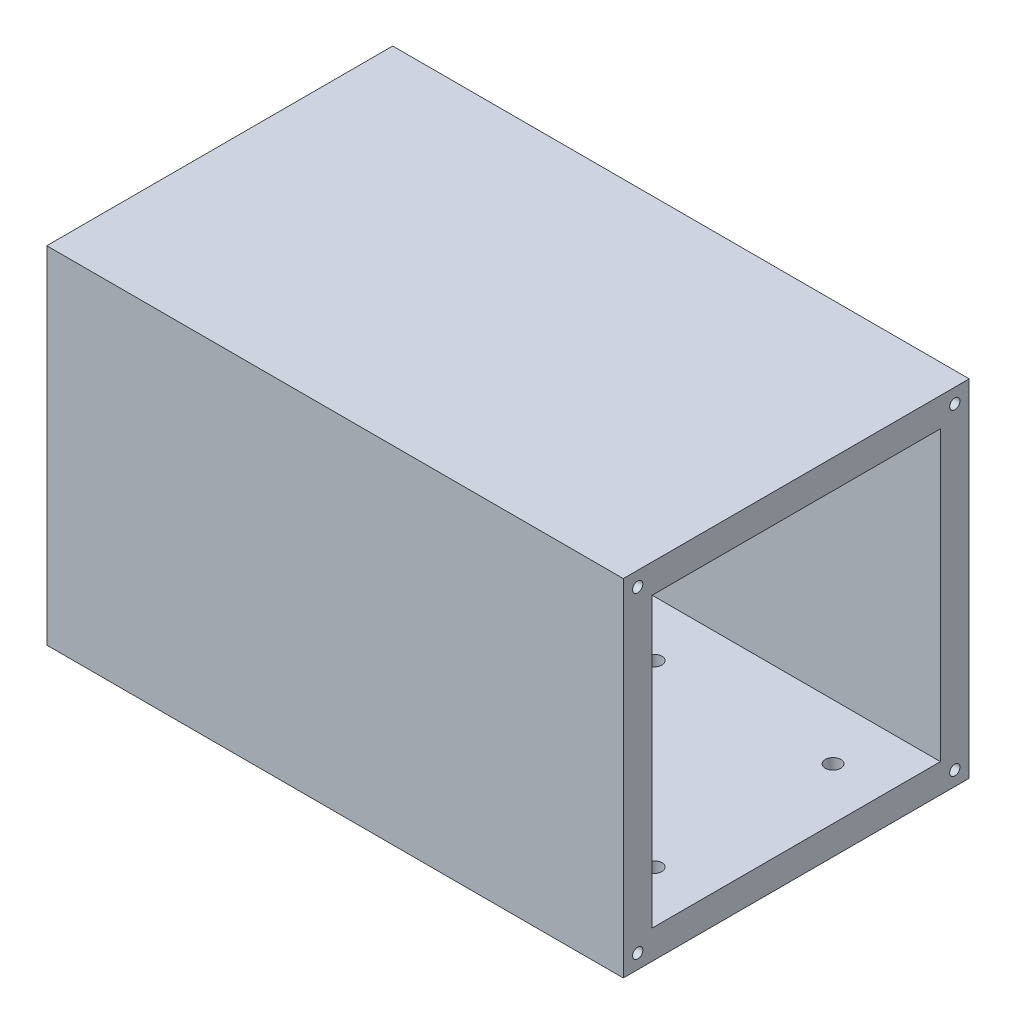
ISO-10303-21;
HEADER;
FILE_DESCRIPTION(('STEP AP214'),'2;1');
FILE_NAME('part.step','',(''),(''),'','','');
FILE_SCHEMA(('AUTOMOTIVE_DESIGN { 1 0 10303 214 1 1 1 1 }'));
ENDSEC;
DATA;
#1=APPLICATION_CONTEXT('core data for automotive mechanical design processes');
#2=APPLICATION_PROTOCOL_DEFINITION('international standard','automotive_design',2000,#1);
#3=PRODUCT_CONTEXT('',#1,'mechanical');
#4=PRODUCT('Part','Part','',(#3));
#5=PRODUCT_RELATED_PRODUCT_CATEGORY('part','',(#4));
#6=PRODUCT_DEFINITION_FORMATION('','',#4);
#7=PRODUCT_DEFINITION_CONTEXT('part definition',#1,'design');
#8=PRODUCT_DEFINITION('design','',#6,#7);
#9=PRODUCT_DEFINITION_SHAPE('','',#8);
#10=(LENGTH_UNIT() NAMED_UNIT(*) SI_UNIT(.MILLI.,.METRE.));
#11=(NAMED_UNIT(*) PLANE_ANGLE_UNIT() SI_UNIT($,.RADIAN.));
#12=(NAMED_UNIT(*) SI_UNIT($,.STERADIAN.) SOLID_ANGLE_UNIT());
#13=UNCERTAINTY_MEASURE_WITH_UNIT(LENGTH_MEASURE(1.E-05),#10,'distance_accuracy_value','');
#14=(GEOMETRIC_REPRESENTATION_CONTEXT(3) GLOBAL_UNCERTAINTY_ASSIGNED_CONTEXT((#13)) GLOBAL_UNIT_ASSIGNED_CONTEXT((#10,
#11,#12)) REPRESENTATION_CONTEXT('',''));
#15=CARTESIAN_POINT('',(0.,0.,0.));
#16=DIRECTION('',(0.,0.,1.));
#17=DIRECTION('',(1.,0.,0.));
#18=AXIS2_PLACEMENT_3D('',#15,#16,#17);
#19=CARTESIAN_POINT('',(-63.5,38.1,-38.1));
#20=DIRECTION('',(0.,0.,-1.));
#21=DIRECTION('',(0.,1.,0.));
#22=AXIS2_PLACEMENT_3D('',#19,#20,#21);
#23=PLANE('',#22);
#24=DIRECTION('',(1.,0.,0.));
#25=VECTOR('',#24,1.);
#26=CARTESIAN_POINT('',(-63.5,38.1,-38.1));
#27=LINE('',#26,#25);
#28=CARTESIAN_POINT('',(-63.5,38.1,-38.1));
#29=VERTEX_POINT('',#28);
#30=CARTESIAN_POINT('',(63.5,38.1,-38.1));
#31=VERTEX_POINT('',#30);
#32=EDGE_CURVE('E52',#29,#31,#27,.T.);
#33=ORIENTED_EDGE('',*,*,#32,.T.);
#34=DIRECTION('',(0.,1.,0.));
#35=VECTOR('',#34,1.);
#36=CARTESIAN_POINT('',(63.5,38.1,-38.1));
#37=LINE('',#36,#35);
#38=CARTESIAN_POINT('',(63.5,-38.1,-38.1));
#39=VERTEX_POINT('',#38);
#40=EDGE_CURVE('E207',#39,#31,#37,.T.);
#41=ORIENTED_EDGE('',*,*,#40,.F.);
#42=DIRECTION('',(1.,0.,0.));
#43=VECTOR('',#42,1.);
#44=CARTESIAN_POINT('',(-63.5,-38.1,-38.1));
#45=LINE('',#44,#43);
#46=CARTESIAN_POINT('',(-63.5,-38.1,-38.1));
#47=VERTEX_POINT('',#46);
#48=EDGE_CURVE('E13',#47,#39,#45,.T.);
#49=ORIENTED_EDGE('',*,*,#48,.F.);
#50=DIRECTION('',(0.,1.,0.));
#51=VECTOR('',#50,1.);
#52=CARTESIAN_POINT('',(-63.5,38.1,-38.1));
#53=LINE('',#52,#51);
#54=EDGE_CURVE('E232',#47,#29,#53,.T.);
#55=ORIENTED_EDGE('',*,*,#54,.T.);
#56=EDGE_LOOP('',(#33,#41,#49,#55));
#57=FACE_BOUND('',#56,.T.);
#58=ADVANCED_FACE('F49',(#57),#23,.T.);
#59=CARTESIAN_POINT('',(-63.5,-38.1,38.1));
#60=DIRECTION('',(0.,-1.,0.));
#61=DIRECTION('',(0.,0.,-1.));
#62=AXIS2_PLACEMENT_3D('',#59,#60,#61);
#63=PLANE('',#62);
#64=CARTESIAN_POINT('',(52.09999994,-38.1,-19.499999922));
#65=DIRECTION('',(0.,-1.,0.));
#66=DIRECTION('',(0.,0.,-1.));
#67=AXIS2_PLACEMENT_3D('',#64,#65,#66);
#68=CIRCLE('',#67,3.25);
#69=CARTESIAN_POINT('',(52.09999994,-38.1,-22.749999922));
#70=VERTEX_POINT('',#69);
#71=EDGE_CURVE('E713',#70,#70,#68,.T.);
#72=ORIENTED_EDGE('',*,*,#71,.F.);
#73=EDGE_LOOP('',(#72));
#74=FACE_BOUND('',#73,.T.);
#75=CARTESIAN_POINT('',(12.7,-38.1,-19.499999922));
#76=DIRECTION('',(0.,-1.,0.));
#77=DIRECTION('',(0.,0.,-1.));
#78=AXIS2_PLACEMENT_3D('',#75,#76,#77);
#79=CIRCLE('',#78,3.25);
#80=CARTESIAN_POINT('',(12.7,-38.1,-22.749999922));
#81=VERTEX_POINT('',#80);
#82=EDGE_CURVE('E723',#81,#81,#79,.T.);
#83=ORIENTED_EDGE('',*,*,#82,.F.);
#84=EDGE_LOOP('',(#83));
#85=FACE_BOUND('',#84,.T.);
#86=CARTESIAN_POINT('',(12.7,-38.1,19.900000078));
#87=DIRECTION('',(0.,-1.,0.));
#88=DIRECTION('',(0.,0.,-1.));
#89=AXIS2_PLACEMENT_3D('',#86,#87,#88);
#90=CIRCLE('',#89,3.25);
#91=CARTESIAN_POINT('',(12.7,-38.1,16.650000078));
#92=VERTEX_POINT('',#91);
#93=EDGE_CURVE('E735',#92,#92,#90,.T.);
#94=ORIENTED_EDGE('',*,*,#93,.F.);
#95=EDGE_LOOP('',(#94));
#96=FACE_BOUND('',#95,.T.);
#97=CARTESIAN_POINT('',(52.1,-38.1,19.900000078));
#98=DIRECTION('',(0.,-1.,0.));
#99=DIRECTION('',(0.,0.,-1.));
#100=AXIS2_PLACEMENT_3D('',#97,#98,#99);
#101=CIRCLE('',#100,3.25);
#102=CARTESIAN_POINT('',(52.1,-38.1,16.650000078));
#103=VERTEX_POINT('',#102);
#104=EDGE_CURVE('E747',#103,#103,#101,.T.);
#105=ORIENTED_EDGE('',*,*,#104,.F.);
#106=EDGE_LOOP('',(#105));
#107=FACE_BOUND('',#106,.T.);
#108=ORIENTED_EDGE('',*,*,#48,.T.);
#109=DIRECTION('',(0.,0.,-1.));
#110=VECTOR('',#109,1.);
#111=CARTESIAN_POINT('',(63.5,-38.1,38.1));
#112=LINE('',#111,#110);
#113=CARTESIAN_POINT('',(63.5,-38.1,38.1));
#114=VERTEX_POINT('',#113);
#115=EDGE_CURVE('E216',#114,#39,#112,.T.);
#116=ORIENTED_EDGE('',*,*,#115,.F.);
#117=DIRECTION('',(1.,0.,0.));
#118=VECTOR('',#117,1.);
#119=CARTESIAN_POINT('',(-63.5,-38.1,38.1));
#120=LINE('',#119,#118);
#121=CARTESIAN_POINT('',(-63.5,-38.1,38.1));
#122=VERTEX_POINT('',#121);
#123=EDGE_CURVE('E57',#122,#114,#120,.T.);
#124=ORIENTED_EDGE('',*,*,#123,.F.);
#125=DIRECTION('',(0.,0.,-1.));
#126=VECTOR('',#125,1.);
#127=CARTESIAN_POINT('',(-63.5,-38.1,38.1));
#128=LINE('',#127,#126);
#129=EDGE_CURVE('E245',#122,#47,#128,.T.);
#130=ORIENTED_EDGE('',*,*,#129,.T.);
#131=EDGE_LOOP('',(#108,#116,#124,#130));
#132=FACE_BOUND('',#131,.T.);
#133=ADVANCED_FACE('F259',(#74,#85,#96,#107,#132),#63,.T.);
#134=CARTESIAN_POINT('',(-63.5,38.1,38.1));
#135=DIRECTION('',(0.,0.,1.));
#136=DIRECTION('',(0.,-1.,0.));
#137=AXIS2_PLACEMENT_3D('',#134,#135,#136);
#138=PLANE('',#137);
#139=ORIENTED_EDGE('',*,*,#123,.T.);
#140=DIRECTION('',(0.,-1.,0.));
#141=VECTOR('',#140,1.);
#142=CARTESIAN_POINT('',(63.5,38.1,38.1));
#143=LINE('',#142,#141);
#144=CARTESIAN_POINT('',(63.5,38.1,38.1));
#145=VERTEX_POINT('',#144);
#146=EDGE_CURVE('E213',#145,#114,#143,.T.);
#147=ORIENTED_EDGE('',*,*,#146,.F.);
#148=DIRECTION('',(1.,0.,0.));
#149=VECTOR('',#148,1.);
#150=CARTESIAN_POINT('',(-63.5,38.1,38.1));
#151=LINE('',#150,#149);
#152=CARTESIAN_POINT('',(-63.5,38.1,38.1));
#153=VERTEX_POINT('',#152);
#154=EDGE_CURVE('E248',#153,#145,#151,.T.);
#155=ORIENTED_EDGE('',*,*,#154,.F.);
#156=DIRECTION('',(0.,-1.,0.));
#157=VECTOR('',#156,1.);
#158=CARTESIAN_POINT('',(-63.5,38.1,38.1));
#159=LINE('',#158,#157);
#160=EDGE_CURVE('E242',#153,#122,#159,.T.);
#161=ORIENTED_EDGE('',*,*,#160,.T.);
#162=EDGE_LOOP('',(#139,#147,#155,#161));
#163=FACE_BOUND('',#162,.T.);
#164=ADVANCED_FACE('F265',(#163),#138,.T.);
#165=CARTESIAN_POINT('',(-63.5,38.1,38.1));
#166=DIRECTION('',(0.,1.,0.));
#167=DIRECTION('',(0.,0.,1.));
#168=AXIS2_PLACEMENT_3D('',#165,#166,#167);
#169=PLANE('',#168);
#170=ORIENTED_EDGE('',*,*,#154,.T.);
#171=DIRECTION('',(0.,0.,1.));
#172=VECTOR('',#171,1.);
#173=CARTESIAN_POINT('',(63.5,38.1,38.1));
#174=LINE('',#173,#172);
#175=EDGE_CURVE('E210',#31,#145,#174,.T.);
#176=ORIENTED_EDGE('',*,*,#175,.F.);
#177=ORIENTED_EDGE('',*,*,#32,.F.);
#178=DIRECTION('',(0.,0.,1.));
#179=VECTOR('',#178,1.);
#180=CARTESIAN_POINT('',(-63.5,38.1,38.1));
#181=LINE('',#180,#179);
#182=EDGE_CURVE('E239',#29,#153,#181,.T.);
#183=ORIENTED_EDGE('',*,*,#182,.T.);
#184=EDGE_LOOP('',(#170,#176,#177,#183));
#185=FACE_BOUND('',#184,.T.);
#186=ADVANCED_FACE('F252',(#185),#169,.T.);
#187=CARTESIAN_POINT('',(-63.5,0.,0.));
#188=DIRECTION('',(1.,0.,0.));
#189=DIRECTION('',(0.,0.,-1.));
#190=AXIS2_PLACEMENT_3D('',#187,#188,#189);
#191=PLANE('',#190);
#192=CARTESIAN_POINT('',(-63.5,34.925,34.925));
#193=DIRECTION('',(-1.,0.,0.));
#194=DIRECTION('',(0.,0.,1.));
#195=AXIS2_PLACEMENT_3D('',#192,#193,#194);
#196=CIRCLE('',#195,1.1303);
#197=CARTESIAN_POINT('',(-63.5,34.925,36.0553));
#198=VERTEX_POINT('',#197);
#199=EDGE_CURVE('E147',#198,#198,#196,.T.);
#200=ORIENTED_EDGE('',*,*,#199,.F.);
#201=EDGE_LOOP('',(#200));
#202=FACE_BOUND('',#201,.T.);
#203=CARTESIAN_POINT('',(-63.5,34.925,-34.925));
#204=DIRECTION('',(-1.,0.,0.));
#205=DIRECTION('',(0.,0.,1.));
#206=AXIS2_PLACEMENT_3D('',#203,#204,#205);
#207=CIRCLE('',#206,1.1303);
#208=CARTESIAN_POINT('',(-63.5,34.925,-33.7947));
#209=VERTEX_POINT('',#208);
#210=EDGE_CURVE('E146',#209,#209,#207,.T.);
#211=ORIENTED_EDGE('',*,*,#210,.F.);
#212=EDGE_LOOP('',(#211));
#213=FACE_BOUND('',#212,.T.);
#214=CARTESIAN_POINT('',(-63.5,-34.925,-34.925));
#215=DIRECTION('',(-1.,0.,0.));
#216=DIRECTION('',(0.,0.,1.));
#217=AXIS2_PLACEMENT_3D('',#214,#215,#216);
#218=CIRCLE('',#217,1.1303);
#219=CARTESIAN_POINT('',(-63.5,-34.925,-33.7947));
#220=VERTEX_POINT('',#219);
#221=EDGE_CURVE('E159',#220,#220,#218,.T.);
#222=ORIENTED_EDGE('',*,*,#221,.F.);
#223=EDGE_LOOP('',(#222));
#224=FACE_BOUND('',#223,.T.);
#225=CARTESIAN_POINT('',(-63.5,-34.925,34.925));
#226=DIRECTION('',(-1.,0.,0.));
#227=DIRECTION('',(0.,0.,1.));
#228=AXIS2_PLACEMENT_3D('',#225,#226,#227);
#229=CIRCLE('',#228,1.1303);
#230=CARTESIAN_POINT('',(-63.5,-34.925,36.0553));
#231=VERTEX_POINT('',#230);
#232=EDGE_CURVE('E165',#231,#231,#229,.T.);
#233=ORIENTED_EDGE('',*,*,#232,.F.);
#234=EDGE_LOOP('',(#233));
#235=FACE_BOUND('',#234,.T.);
#236=DIRECTION('',(0.,0.,-1.));
#237=VECTOR('',#236,1.);
#238=CARTESIAN_POINT('',(-63.5,-31.75,31.75));
#239=LINE('',#238,#237);
#240=CARTESIAN_POINT('',(-63.5,-31.75,31.75));
#241=VERTEX_POINT('',#240);
#242=CARTESIAN_POINT('',(-63.5,-31.75,-31.75));
#243=VERTEX_POINT('',#242);
#244=EDGE_CURVE('E226',#241,#243,#239,.T.);
#245=ORIENTED_EDGE('',*,*,#244,.T.);
#246=DIRECTION('',(0.,1.,0.));
#247=VECTOR('',#246,1.);
#248=CARTESIAN_POINT('',(-63.5,-31.75,-31.75));
#249=LINE('',#248,#247);
#250=CARTESIAN_POINT('',(-63.5,31.75,-31.75));
#251=VERTEX_POINT('',#250);
#252=EDGE_CURVE('E219',#243,#251,#249,.T.);
#253=ORIENTED_EDGE('',*,*,#252,.T.);
#254=DIRECTION('',(0.,0.,1.));
#255=VECTOR('',#254,1.);
#256=CARTESIAN_POINT('',(-63.5,31.75,31.75));
#257=LINE('',#256,#255);
#258=CARTESIAN_POINT('',(-63.5,31.75,31.75));
#259=VERTEX_POINT('',#258);
#260=EDGE_CURVE('E222',#251,#259,#257,.T.);
#261=ORIENTED_EDGE('',*,*,#260,.T.);
#262=DIRECTION('',(0.,-1.,0.));
#263=VECTOR('',#262,1.);
#264=CARTESIAN_POINT('',(-63.5,-31.75,31.75));
#265=LINE('',#264,#263);
#266=EDGE_CURVE('E65',#259,#241,#265,.T.);
#267=ORIENTED_EDGE('',*,*,#266,.T.);
#268=EDGE_LOOP('',(#245,#253,#261,#267));
#269=FACE_BOUND('',#268,.T.);
#270=ORIENTED_EDGE('',*,*,#54,.F.);
#271=ORIENTED_EDGE('',*,*,#129,.F.);
#272=ORIENTED_EDGE('',*,*,#160,.F.);
#273=ORIENTED_EDGE('',*,*,#182,.F.);
#274=EDGE_LOOP('',(#270,#271,#272,#273));
#275=FACE_BOUND('',#274,.T.);
#276=ADVANCED_FACE('F263',(#202,#213,#224,#235,#269,#275),#191,.F.);
#277=CARTESIAN_POINT('',(-63.5,-31.75,-31.75));
#278=DIRECTION('',(0.,0.,-1.));
#279=DIRECTION('',(-1.,0.,0.));
#280=AXIS2_PLACEMENT_3D('',#277,#278,#279);
#281=PLANE('',#280);
#282=DIRECTION('',(1.,0.,0.));
#283=VECTOR('',#282,1.);
#284=CARTESIAN_POINT('',(-63.5,-31.75,-31.75));
#285=LINE('',#284,#283);
#286=CARTESIAN_POINT('',(63.5,-31.75,-31.75));
#287=VERTEX_POINT('',#286);
#288=EDGE_CURVE('E230',#243,#287,#285,.T.);
#289=ORIENTED_EDGE('',*,*,#288,.T.);
#290=DIRECTION('',(0.,1.,0.));
#291=VECTOR('',#290,1.);
#292=CARTESIAN_POINT('',(63.5,-31.75,-31.75));
#293=LINE('',#292,#291);
#294=CARTESIAN_POINT('',(63.5,31.75,-31.75));
#295=VERTEX_POINT('',#294);
#296=EDGE_CURVE('E195',#287,#295,#293,.T.);
#297=ORIENTED_EDGE('',*,*,#296,.T.);
#298=DIRECTION('',(1.,0.,0.));
#299=VECTOR('',#298,1.);
#300=CARTESIAN_POINT('',(-63.5,31.75,-31.75));
#301=LINE('',#300,#299);
#302=EDGE_CURVE('E229',#251,#295,#301,.T.);
#303=ORIENTED_EDGE('',*,*,#302,.F.);
#304=ORIENTED_EDGE('',*,*,#252,.F.);
#305=EDGE_LOOP('',(#289,#297,#303,#304));
#306=FACE_BOUND('',#305,.T.);
#307=ADVANCED_FACE('F298',(#306),#281,.F.);
#308=CARTESIAN_POINT('',(-63.5,-31.75,31.75));
#309=DIRECTION('',(0.,-1.,0.));
#310=DIRECTION('',(0.,0.,-1.));
#311=AXIS2_PLACEMENT_3D('',#308,#309,#310);
#312=PLANE('',#311);
#313=CARTESIAN_POINT('',(52.09999994,-31.75,-19.499999922));
#314=DIRECTION('',(0.,-1.,0.));
#315=DIRECTION('',(0.,0.,-1.));
#316=AXIS2_PLACEMENT_3D('',#313,#314,#315);
#317=CIRCLE('',#316,1.7);
#318=CARTESIAN_POINT('',(52.09999994,-31.75,-21.199999922));
#319=VERTEX_POINT('',#318);
#320=EDGE_CURVE('E720',#319,#319,#317,.T.);
#321=ORIENTED_EDGE('',*,*,#320,.T.);
#322=EDGE_LOOP('',(#321));
#323=FACE_BOUND('',#322,.T.);
#324=CARTESIAN_POINT('',(12.7,-31.75,-19.499999922));
#325=DIRECTION('',(0.,-1.,0.));
#326=DIRECTION('',(0.,0.,-1.));
#327=AXIS2_PLACEMENT_3D('',#324,#325,#326);
#328=CIRCLE('',#327,1.7);
#329=CARTESIAN_POINT('',(12.7,-31.75,-21.199999922));
#330=VERTEX_POINT('',#329);
#331=EDGE_CURVE('E732',#330,#330,#328,.T.);
#332=ORIENTED_EDGE('',*,*,#331,.T.);
#333=EDGE_LOOP('',(#332));
#334=FACE_BOUND('',#333,.T.);
#335=CARTESIAN_POINT('',(12.7,-31.75,19.900000078));
#336=DIRECTION('',(0.,-1.,0.));
#337=DIRECTION('',(0.,0.,-1.));
#338=AXIS2_PLACEMENT_3D('',#335,#336,#337);
#339=CIRCLE('',#338,1.7);
#340=CARTESIAN_POINT('',(12.7,-31.75,18.200000078));
#341=VERTEX_POINT('',#340);
#342=EDGE_CURVE('E744',#341,#341,#339,.T.);
#343=ORIENTED_EDGE('',*,*,#342,.T.);
#344=EDGE_LOOP('',(#343));
#345=FACE_BOUND('',#344,.T.);
#346=CARTESIAN_POINT('',(52.1,-31.75,19.900000078));
#347=DIRECTION('',(0.,-1.,0.));
#348=DIRECTION('',(0.,0.,-1.));
#349=AXIS2_PLACEMENT_3D('',#346,#347,#348);
#350=CIRCLE('',#349,1.7);
#351=CARTESIAN_POINT('',(52.1,-31.75,18.200000078));
#352=VERTEX_POINT('',#351);
#353=EDGE_CURVE('E153',#352,#352,#350,.T.);
#354=ORIENTED_EDGE('',*,*,#353,.T.);
#355=EDGE_LOOP('',(#354));
#356=FACE_BOUND('',#355,.T.);
#357=DIRECTION('',(1.,0.,0.));
#358=VECTOR('',#357,1.);
#359=CARTESIAN_POINT('',(-63.5,-31.75,31.75));
#360=LINE('',#359,#358);
#361=CARTESIAN_POINT('',(63.5,-31.75,31.75));
#362=VERTEX_POINT('',#361);
#363=EDGE_CURVE('E233',#241,#362,#360,.T.);
#364=ORIENTED_EDGE('',*,*,#363,.T.);
#365=DIRECTION('',(0.,0.,-1.));
#366=VECTOR('',#365,1.);
#367=CARTESIAN_POINT('',(63.5,-31.75,31.75));
#368=LINE('',#367,#366);
#369=EDGE_CURVE('E204',#362,#287,#368,.T.);
#370=ORIENTED_EDGE('',*,*,#369,.T.);
#371=ORIENTED_EDGE('',*,*,#288,.F.);
#372=ORIENTED_EDGE('',*,*,#244,.F.);
#373=EDGE_LOOP('',(#364,#370,#371,#372));
#374=FACE_BOUND('',#373,.T.);
#375=ADVANCED_FACE('F292',(#323,#334,#345,#356,#374),#312,.F.);
#376=CARTESIAN_POINT('',(-63.5,-31.75,31.75));
#377=DIRECTION('',(0.,0.,1.));
#378=DIRECTION('',(1.,0.,0.));
#379=AXIS2_PLACEMENT_3D('',#376,#377,#378);
#380=PLANE('',#379);
#381=DIRECTION('',(1.,0.,0.));
#382=VECTOR('',#381,1.);
#383=CARTESIAN_POINT('',(-63.5,31.75,31.75));
#384=LINE('',#383,#382);
#385=CARTESIAN_POINT('',(63.5,31.75,31.75));
#386=VERTEX_POINT('',#385);
#387=EDGE_CURVE('E235',#259,#386,#384,.T.);
#388=ORIENTED_EDGE('',*,*,#387,.T.);
#389=DIRECTION('',(0.,-1.,0.));
#390=VECTOR('',#389,1.);
#391=CARTESIAN_POINT('',(63.5,-31.75,31.75));
#392=LINE('',#391,#390);
#393=EDGE_CURVE('E201',#386,#362,#392,.T.);
#394=ORIENTED_EDGE('',*,*,#393,.T.);
#395=ORIENTED_EDGE('',*,*,#363,.F.);
#396=ORIENTED_EDGE('',*,*,#266,.F.);
#397=EDGE_LOOP('',(#388,#394,#395,#396));
#398=FACE_BOUND('',#397,.T.);
#399=ADVANCED_FACE('F297',(#398),#380,.F.);
#400=CARTESIAN_POINT('',(-63.5,31.75,31.75));
#401=DIRECTION('',(0.,1.,0.));
#402=DIRECTION('',(0.,0.,1.));
#403=AXIS2_PLACEMENT_3D('',#400,#401,#402);
#404=PLANE('',#403);
#405=ORIENTED_EDGE('',*,*,#302,.T.);
#406=DIRECTION('',(0.,0.,1.));
#407=VECTOR('',#406,1.);
#408=CARTESIAN_POINT('',(63.5,31.75,31.75));
#409=LINE('',#408,#407);
#410=EDGE_CURVE('E198',#295,#386,#409,.T.);
#411=ORIENTED_EDGE('',*,*,#410,.T.);
#412=ORIENTED_EDGE('',*,*,#387,.F.);
#413=ORIENTED_EDGE('',*,*,#260,.F.);
#414=EDGE_LOOP('',(#405,#411,#412,#413));
#415=FACE_BOUND('',#414,.T.);
#416=ADVANCED_FACE('F593',(#415),#404,.F.);
#417=CARTESIAN_POINT('',(63.5,0.,0.));
#418=DIRECTION('',(1.,0.,0.));
#419=DIRECTION('',(0.,0.,-1.));
#420=AXIS2_PLACEMENT_3D('',#417,#418,#419);
#421=PLANE('',#420);
#422=CARTESIAN_POINT('',(63.5,34.925,34.925));
#423=DIRECTION('',(1.,0.,0.));
#424=DIRECTION('',(0.,0.,-1.));
#425=AXIS2_PLACEMENT_3D('',#422,#423,#424);
#426=CIRCLE('',#425,1.1303);
#427=CARTESIAN_POINT('',(63.5,34.925,33.7947));
#428=VERTEX_POINT('',#427);
#429=EDGE_CURVE('E171',#428,#428,#426,.T.);
#430=ORIENTED_EDGE('',*,*,#429,.F.);
#431=EDGE_LOOP('',(#430));
#432=FACE_BOUND('',#431,.T.);
#433=CARTESIAN_POINT('',(63.5,34.925,-34.925));
#434=DIRECTION('',(1.,0.,0.));
#435=DIRECTION('',(0.,0.,-1.));
#436=AXIS2_PLACEMENT_3D('',#433,#434,#435);
#437=CIRCLE('',#436,1.1303);
#438=CARTESIAN_POINT('',(63.5,34.925,-36.0553));
#439=VERTEX_POINT('',#438);
#440=EDGE_CURVE('E177',#439,#439,#437,.T.);
#441=ORIENTED_EDGE('',*,*,#440,.F.);
#442=EDGE_LOOP('',(#441));
#443=FACE_BOUND('',#442,.T.);
#444=CARTESIAN_POINT('',(63.5,-34.925,-34.925));
#445=DIRECTION('',(1.,0.,0.));
#446=DIRECTION('',(0.,0.,-1.));
#447=AXIS2_PLACEMENT_3D('',#444,#445,#446);
#448=CIRCLE('',#447,1.1303);
#449=CARTESIAN_POINT('',(63.5,-34.925,-36.0553));
#450=VERTEX_POINT('',#449);
#451=EDGE_CURVE('E183',#450,#450,#448,.T.);
#452=ORIENTED_EDGE('',*,*,#451,.F.);
#453=EDGE_LOOP('',(#452));
#454=FACE_BOUND('',#453,.T.);
#455=CARTESIAN_POINT('',(63.5,-34.925,34.925));
#456=DIRECTION('',(1.,0.,0.));
#457=DIRECTION('',(0.,0.,-1.));
#458=AXIS2_PLACEMENT_3D('',#455,#456,#457);
#459=CIRCLE('',#458,1.1303);
#460=CARTESIAN_POINT('',(63.5,-34.925,33.7947));
#461=VERTEX_POINT('',#460);
#462=EDGE_CURVE('E189',#461,#461,#459,.T.);
#463=ORIENTED_EDGE('',*,*,#462,.F.);
#464=EDGE_LOOP('',(#463));
#465=FACE_BOUND('',#464,.T.);
#466=ORIENTED_EDGE('',*,*,#40,.T.);
#467=ORIENTED_EDGE('',*,*,#175,.T.);
#468=ORIENTED_EDGE('',*,*,#146,.T.);
#469=ORIENTED_EDGE('',*,*,#115,.T.);
#470=EDGE_LOOP('',(#466,#467,#468,#469));
#471=FACE_BOUND('',#470,.T.);
#472=ORIENTED_EDGE('',*,*,#410,.F.);
#473=ORIENTED_EDGE('',*,*,#296,.F.);
#474=ORIENTED_EDGE('',*,*,#369,.F.);
#475=ORIENTED_EDGE('',*,*,#393,.F.);
#476=EDGE_LOOP('',(#472,#473,#474,#475));
#477=FACE_BOUND('',#476,.T.);
#478=ADVANCED_FACE('F255',(#432,#443,#454,#465,#471,#477),#421,.T.);
#479=CARTESIAN_POINT('',(55.88,-34.925,34.925));
#480=DIRECTION('',(1.,0.,0.));
#481=DIRECTION('',(0.,0.,-1.));
#482=AXIS2_PLACEMENT_3D('',#479,#480,#481);
#483=CONICAL_SURFACE('',#482,1.13029999999999,1.02974425867666);
#484=CARTESIAN_POINT('',(55.2008472423132,-34.925,34.925));
#485=VERTEX_POINT('',#484);
#486=VERTEX_LOOP('',#485);
#487=FACE_BOUND('',#486,.T.);
#488=CARTESIAN_POINT('',(55.88,-34.925,34.925));
#489=DIRECTION('',(1.,0.,0.));
#490=DIRECTION('',(0.,0.,-1.));
#491=AXIS2_PLACEMENT_3D('',#488,#489,#490);
#492=CIRCLE('',#491,1.13029999999999);
#493=CARTESIAN_POINT('',(55.88,-34.925,33.7947));
#494=VERTEX_POINT('',#493);
#495=EDGE_CURVE('E192',#494,#494,#492,.T.);
#496=ORIENTED_EDGE('',*,*,#495,.T.);
#497=EDGE_LOOP('',(#496));
#498=FACE_BOUND('',#497,.T.);
#499=ADVANCED_FACE('F442',(#487,#498),#483,.F.);
#500=CARTESIAN_POINT('',(63.5,-34.925,34.925));
#501=DIRECTION('',(1.,0.,0.));
#502=DIRECTION('',(0.,0.,-1.));
#503=AXIS2_PLACEMENT_3D('',#500,#501,#502);
#504=CYLINDRICAL_SURFACE('',#503,1.1303);
#505=ORIENTED_EDGE('',*,*,#495,.F.);
#506=EDGE_LOOP('',(#505));
#507=FACE_BOUND('',#506,.T.);
#508=ORIENTED_EDGE('',*,*,#462,.T.);
#509=EDGE_LOOP('',(#508));
#510=FACE_BOUND('',#509,.T.);
#511=ADVANCED_FACE('F435',(#507,#510),#504,.F.);
#512=CARTESIAN_POINT('',(55.88,-34.925,-34.925));
#513=DIRECTION('',(1.,0.,0.));
#514=DIRECTION('',(0.,0.,-1.));
#515=AXIS2_PLACEMENT_3D('',#512,#513,#514);
#516=CONICAL_SURFACE('',#515,1.13029999999999,1.02974425867666);
#517=CARTESIAN_POINT('',(55.2008472423132,-34.925,-34.925));
#518=VERTEX_POINT('',#517);
#519=VERTEX_LOOP('',#518);
#520=FACE_BOUND('',#519,.T.);
#521=CARTESIAN_POINT('',(55.88,-34.925,-34.925));
#522=DIRECTION('',(1.,0.,0.));
#523=DIRECTION('',(0.,0.,-1.));
#524=AXIS2_PLACEMENT_3D('',#521,#522,#523);
#525=CIRCLE('',#524,1.13029999999999);
#526=CARTESIAN_POINT('',(55.88,-34.925,-36.0553));
#527=VERTEX_POINT('',#526);
#528=EDGE_CURVE('E186',#527,#527,#525,.T.);
#529=ORIENTED_EDGE('',*,*,#528,.T.);
#530=EDGE_LOOP('',(#529));
#531=FACE_BOUND('',#530,.T.);
#532=ADVANCED_FACE('F441',(#520,#531),#516,.F.);
#533=CARTESIAN_POINT('',(63.5,-34.925,-34.925));
#534=DIRECTION('',(1.,0.,0.));
#535=DIRECTION('',(0.,0.,-1.));
#536=AXIS2_PLACEMENT_3D('',#533,#534,#535);
#537=CYLINDRICAL_SURFACE('',#536,1.1303);
#538=ORIENTED_EDGE('',*,*,#528,.F.);
#539=EDGE_LOOP('',(#538));
#540=FACE_BOUND('',#539,.T.);
#541=ORIENTED_EDGE('',*,*,#451,.T.);
#542=EDGE_LOOP('',(#541));
#543=FACE_BOUND('',#542,.T.);
#544=ADVANCED_FACE('F451',(#540,#543),#537,.F.);
#545=CARTESIAN_POINT('',(55.88,34.925,-34.925));
#546=DIRECTION('',(1.,0.,0.));
#547=DIRECTION('',(0.,0.,-1.));
#548=AXIS2_PLACEMENT_3D('',#545,#546,#547);
#549=CONICAL_SURFACE('',#548,1.13029999999999,1.02974425867666);
#550=CARTESIAN_POINT('',(55.2008472423132,34.925,-34.925));
#551=VERTEX_POINT('',#550);
#552=VERTEX_LOOP('',#551);
#553=FACE_BOUND('',#552,.T.);
#554=CARTESIAN_POINT('',(55.88,34.925,-34.925));
#555=DIRECTION('',(1.,0.,0.));
#556=DIRECTION('',(0.,0.,-1.));
#557=AXIS2_PLACEMENT_3D('',#554,#555,#556);
#558=CIRCLE('',#557,1.13029999999999);
#559=CARTESIAN_POINT('',(55.88,34.925,-36.0553));
#560=VERTEX_POINT('',#559);
#561=EDGE_CURVE('E180',#560,#560,#558,.T.);
#562=ORIENTED_EDGE('',*,*,#561,.T.);
#563=EDGE_LOOP('',(#562));
#564=FACE_BOUND('',#563,.T.);
#565=ADVANCED_FACE('F457',(#553,#564),#549,.F.);
#566=CARTESIAN_POINT('',(63.5,34.925,-34.925));
#567=DIRECTION('',(1.,0.,0.));
#568=DIRECTION('',(0.,0.,-1.));
#569=AXIS2_PLACEMENT_3D('',#566,#567,#568);
#570=CYLINDRICAL_SURFACE('',#569,1.1303);
#571=ORIENTED_EDGE('',*,*,#561,.F.);
#572=EDGE_LOOP('',(#571));
#573=FACE_BOUND('',#572,.T.);
#574=ORIENTED_EDGE('',*,*,#440,.T.);
#575=EDGE_LOOP('',(#574));
#576=FACE_BOUND('',#575,.T.);
#577=ADVANCED_FACE('F465',(#573,#576),#570,.F.);
#578=CARTESIAN_POINT('',(55.88,34.925,34.925));
#579=DIRECTION('',(1.,0.,0.));
#580=DIRECTION('',(0.,0.,-1.));
#581=AXIS2_PLACEMENT_3D('',#578,#579,#580);
#582=CONICAL_SURFACE('',#581,1.13029999999999,1.02974425867666);
#583=CARTESIAN_POINT('',(55.2008472423132,34.925,34.925));
#584=VERTEX_POINT('',#583);
#585=VERTEX_LOOP('',#584);
#586=FACE_BOUND('',#585,.T.);
#587=CARTESIAN_POINT('',(55.88,34.925,34.925));
#588=DIRECTION('',(1.,0.,0.));
#589=DIRECTION('',(0.,0.,-1.));
#590=AXIS2_PLACEMENT_3D('',#587,#588,#589);
#591=CIRCLE('',#590,1.13029999999999);
#592=CARTESIAN_POINT('',(55.88,34.925,33.7947));
#593=VERTEX_POINT('',#592);
#594=EDGE_CURVE('E174',#593,#593,#591,.T.);
#595=ORIENTED_EDGE('',*,*,#594,.T.);
#596=EDGE_LOOP('',(#595));
#597=FACE_BOUND('',#596,.T.);
#598=ADVANCED_FACE('F471',(#586,#597),#582,.F.);
#599=CARTESIAN_POINT('',(63.5,34.925,34.925));
#600=DIRECTION('',(1.,0.,0.));
#601=DIRECTION('',(0.,0.,-1.));
#602=AXIS2_PLACEMENT_3D('',#599,#600,#601);
#603=CYLINDRICAL_SURFACE('',#602,1.1303);
#604=ORIENTED_EDGE('',*,*,#594,.F.);
#605=EDGE_LOOP('',(#604));
#606=FACE_BOUND('',#605,.T.);
#607=ORIENTED_EDGE('',*,*,#429,.T.);
#608=EDGE_LOOP('',(#607));
#609=FACE_BOUND('',#608,.T.);
#610=ADVANCED_FACE('F479',(#606,#609),#603,.F.);
#611=CARTESIAN_POINT('',(-55.88,-34.925,34.925));
#612=DIRECTION('',(-1.,0.,0.));
#613=DIRECTION('',(0.,0.,1.));
#614=AXIS2_PLACEMENT_3D('',#611,#612,#613);
#615=CONICAL_SURFACE('',#614,1.13029999999999,1.02974425867666);
#616=CARTESIAN_POINT('',(-55.2008472423132,-34.925,34.925));
#617=VERTEX_POINT('',#616);
#618=VERTEX_LOOP('',#617);
#619=FACE_BOUND('',#618,.T.);
#620=CARTESIAN_POINT('',(-55.88,-34.925,34.925));
#621=DIRECTION('',(-1.,0.,0.));
#622=DIRECTION('',(0.,0.,1.));
#623=AXIS2_PLACEMENT_3D('',#620,#621,#622);
#624=CIRCLE('',#623,1.13029999999999);
#625=CARTESIAN_POINT('',(-55.88,-34.925,36.0553));
#626=VERTEX_POINT('',#625);
#627=EDGE_CURVE('E168',#626,#626,#624,.T.);
#628=ORIENTED_EDGE('',*,*,#627,.T.);
#629=EDGE_LOOP('',(#628));
#630=FACE_BOUND('',#629,.T.);
#631=ADVANCED_FACE('F484',(#619,#630),#615,.F.);
#632=CARTESIAN_POINT('',(-63.5,-34.925,34.925));
#633=DIRECTION('',(-1.,0.,0.));
#634=DIRECTION('',(0.,0.,1.));
#635=AXIS2_PLACEMENT_3D('',#632,#633,#634);
#636=CYLINDRICAL_SURFACE('',#635,1.1303);
#637=ORIENTED_EDGE('',*,*,#627,.F.);
#638=EDGE_LOOP('',(#637));
#639=FACE_BOUND('',#638,.T.);
#640=ORIENTED_EDGE('',*,*,#232,.T.);
#641=EDGE_LOOP('',(#640));
#642=FACE_BOUND('',#641,.T.);
#643=ADVANCED_FACE('F530',(#639,#642),#636,.F.);
#644=CARTESIAN_POINT('',(-55.88,-34.925,-34.925));
#645=DIRECTION('',(-1.,0.,0.));
#646=DIRECTION('',(0.,0.,1.));
#647=AXIS2_PLACEMENT_3D('',#644,#645,#646);
#648=CONICAL_SURFACE('',#647,1.13029999999999,1.02974425867666);
#649=CARTESIAN_POINT('',(-55.2008472423132,-34.925,-34.925));
#650=VERTEX_POINT('',#649);
#651=VERTEX_LOOP('',#650);
#652=FACE_BOUND('',#651,.T.);
#653=CARTESIAN_POINT('',(-55.88,-34.925,-34.925));
#654=DIRECTION('',(-1.,0.,0.));
#655=DIRECTION('',(0.,0.,1.));
#656=AXIS2_PLACEMENT_3D('',#653,#654,#655);
#657=CIRCLE('',#656,1.13029999999999);
#658=CARTESIAN_POINT('',(-55.88,-34.925,-33.7947));
#659=VERTEX_POINT('',#658);
#660=EDGE_CURVE('E162',#659,#659,#657,.T.);
#661=ORIENTED_EDGE('',*,*,#660,.T.);
#662=EDGE_LOOP('',(#661));
#663=FACE_BOUND('',#662,.T.);
#664=ADVANCED_FACE('F522',(#652,#663),#648,.F.);
#665=CARTESIAN_POINT('',(-63.5,-34.925,-34.925));
#666=DIRECTION('',(-1.,0.,0.));
#667=DIRECTION('',(0.,0.,1.));
#668=AXIS2_PLACEMENT_3D('',#665,#666,#667);
#669=CYLINDRICAL_SURFACE('',#668,1.1303);
#670=ORIENTED_EDGE('',*,*,#660,.F.);
#671=EDGE_LOOP('',(#670));
#672=FACE_BOUND('',#671,.T.);
#673=ORIENTED_EDGE('',*,*,#221,.T.);
#674=EDGE_LOOP('',(#673));
#675=FACE_BOUND('',#674,.T.);
#676=ADVANCED_FACE('F514',(#672,#675),#669,.F.);
#677=CARTESIAN_POINT('',(-55.88,34.925,-34.925));
#678=DIRECTION('',(-1.,0.,0.));
#679=DIRECTION('',(0.,0.,1.));
#680=AXIS2_PLACEMENT_3D('',#677,#678,#679);
#681=CONICAL_SURFACE('',#680,1.13029999999999,1.02974425867666);
#682=CARTESIAN_POINT('',(-55.2008472423132,34.925,-34.925));
#683=VERTEX_POINT('',#682);
#684=VERTEX_LOOP('',#683);
#685=FACE_BOUND('',#684,.T.);
#686=CARTESIAN_POINT('',(-55.88,34.925,-34.925));
#687=DIRECTION('',(-1.,0.,0.));
#688=DIRECTION('',(0.,0.,1.));
#689=AXIS2_PLACEMENT_3D('',#686,#687,#688);
#690=CIRCLE('',#689,1.13029999999999);
#691=CARTESIAN_POINT('',(-55.88,34.925,-33.7947));
#692=VERTEX_POINT('',#691);
#693=EDGE_CURVE('E150',#692,#692,#690,.T.);
#694=ORIENTED_EDGE('',*,*,#693,.T.);
#695=EDGE_LOOP('',(#694));
#696=FACE_BOUND('',#695,.T.);
#697=ADVANCED_FACE('F508',(#685,#696),#681,.F.);
#698=CARTESIAN_POINT('',(-63.5,34.925,-34.925));
#699=DIRECTION('',(-1.,0.,0.));
#700=DIRECTION('',(0.,0.,1.));
#701=AXIS2_PLACEMENT_3D('',#698,#699,#700);
#702=CYLINDRICAL_SURFACE('',#701,1.1303);
#703=ORIENTED_EDGE('',*,*,#693,.F.);
#704=EDGE_LOOP('',(#703));
#705=FACE_BOUND('',#704,.T.);
#706=ORIENTED_EDGE('',*,*,#210,.T.);
#707=EDGE_LOOP('',(#706));
#708=FACE_BOUND('',#707,.T.);
#709=ADVANCED_FACE('F140',(#705,#708),#702,.F.);
#710=CARTESIAN_POINT('',(-55.88,34.925,34.925));
#711=DIRECTION('',(-1.,0.,0.));
#712=DIRECTION('',(0.,0.,1.));
#713=AXIS2_PLACEMENT_3D('',#710,#711,#712);
#714=CONICAL_SURFACE('',#713,1.13029999999999,1.02974425867666);
#715=CARTESIAN_POINT('',(-55.2008472423132,34.925,34.925));
#716=VERTEX_POINT('',#715);
#717=VERTEX_LOOP('',#716);
#718=FACE_BOUND('',#717,.T.);
#719=CARTESIAN_POINT('',(-55.88,34.925,34.925));
#720=DIRECTION('',(-1.,0.,0.));
#721=DIRECTION('',(0.,0.,1.));
#722=AXIS2_PLACEMENT_3D('',#719,#720,#721);
#723=CIRCLE('',#722,1.13029999999999);
#724=CARTESIAN_POINT('',(-55.88,34.925,36.0553));
#725=VERTEX_POINT('',#724);
#726=EDGE_CURVE('E144',#725,#725,#723,.T.);
#727=ORIENTED_EDGE('',*,*,#726,.T.);
#728=EDGE_LOOP('',(#727));
#729=FACE_BOUND('',#728,.T.);
#730=ADVANCED_FACE('F136',(#718,#729),#714,.F.);
#731=CARTESIAN_POINT('',(-63.5,34.925,34.925));
#732=DIRECTION('',(-1.,0.,0.));
#733=DIRECTION('',(0.,0.,1.));
#734=AXIS2_PLACEMENT_3D('',#731,#732,#733);
#735=CYLINDRICAL_SURFACE('',#734,1.1303);
#736=ORIENTED_EDGE('',*,*,#726,.F.);
#737=EDGE_LOOP('',(#736));
#738=FACE_BOUND('',#737,.T.);
#739=ORIENTED_EDGE('',*,*,#199,.T.);
#740=EDGE_LOOP('',(#739));
#741=FACE_BOUND('',#740,.T.);
#742=ADVANCED_FACE('F139',(#738,#741),#735,.F.);
#743=CARTESIAN_POINT('',(52.1,-38.1,19.900000078));
#744=DIRECTION('',(0.,-1.,0.));
#745=DIRECTION('',(0.,0.,-1.));
#746=AXIS2_PLACEMENT_3D('',#743,#744,#745);
#747=CYLINDRICAL_SURFACE('',#746,1.7);
#748=ORIENTED_EDGE('',*,*,#353,.F.);
#749=EDGE_LOOP('',(#748));
#750=FACE_BOUND('',#749,.T.);
#751=CARTESIAN_POINT('',(52.1,-35.1,19.900000078));
#752=DIRECTION('',(0.,-1.,0.));
#753=DIRECTION('',(0.,0.,-1.));
#754=AXIS2_PLACEMENT_3D('',#751,#752,#753);
#755=CIRCLE('',#754,1.7);
#756=CARTESIAN_POINT('',(52.1,-35.1,18.200000078));
#757=VERTEX_POINT('',#756);
#758=EDGE_CURVE('E753',#757,#757,#755,.T.);
#759=ORIENTED_EDGE('',*,*,#758,.T.);
#760=EDGE_LOOP('',(#759));
#761=FACE_BOUND('',#760,.T.);
#762=ADVANCED_FACE('F308',(#750,#761),#747,.F.);
#763=CARTESIAN_POINT('',(53.8,-35.1,19.900000078));
#764=DIRECTION('',(0.,1.,0.));
#765=DIRECTION('',(0.,0.,1.));
#766=AXIS2_PLACEMENT_3D('',#763,#764,#765);
#767=PLANE('',#766);
#768=ORIENTED_EDGE('',*,*,#758,.F.);
#769=EDGE_LOOP('',(#768));
#770=FACE_BOUND('',#769,.T.);
#771=CARTESIAN_POINT('',(52.1,-35.1,19.900000078));
#772=DIRECTION('',(0.,-1.,0.));
#773=DIRECTION('',(0.,0.,-1.));
#774=AXIS2_PLACEMENT_3D('',#771,#772,#773);
#775=CIRCLE('',#774,3.25);
#776=CARTESIAN_POINT('',(52.1,-35.1,16.650000078));
#777=VERTEX_POINT('',#776);
#778=EDGE_CURVE('E750',#777,#777,#775,.T.);
#779=ORIENTED_EDGE('',*,*,#778,.T.);
#780=EDGE_LOOP('',(#779));
#781=FACE_BOUND('',#780,.T.);
#782=ADVANCED_FACE('F313',(#770,#781),#767,.F.);
#783=CARTESIAN_POINT('',(52.1,-38.1,19.900000078));
#784=DIRECTION('',(0.,-1.,0.));
#785=DIRECTION('',(0.,0.,-1.));
#786=AXIS2_PLACEMENT_3D('',#783,#784,#785);
#787=CYLINDRICAL_SURFACE('',#786,3.25);
#788=ORIENTED_EDGE('',*,*,#778,.F.);
#789=EDGE_LOOP('',(#788));
#790=FACE_BOUND('',#789,.T.);
#791=ORIENTED_EDGE('',*,*,#104,.T.);
#792=EDGE_LOOP('',(#791));
#793=FACE_BOUND('',#792,.T.);
#794=ADVANCED_FACE('F324',(#790,#793),#787,.F.);
#795=CARTESIAN_POINT('',(12.7,-38.1,19.900000078));
#796=DIRECTION('',(0.,-1.,0.));
#797=DIRECTION('',(0.,0.,-1.));
#798=AXIS2_PLACEMENT_3D('',#795,#796,#797);
#799=CYLINDRICAL_SURFACE('',#798,1.7);
#800=ORIENTED_EDGE('',*,*,#342,.F.);
#801=EDGE_LOOP('',(#800));
#802=FACE_BOUND('',#801,.T.);
#803=CARTESIAN_POINT('',(12.7,-35.1,19.900000078));
#804=DIRECTION('',(0.,-1.,0.));
#805=DIRECTION('',(0.,0.,-1.));
#806=AXIS2_PLACEMENT_3D('',#803,#804,#805);
#807=CIRCLE('',#806,1.7);
#808=CARTESIAN_POINT('',(12.7,-35.1,18.200000078));
#809=VERTEX_POINT('',#808);
#810=EDGE_CURVE('E741',#809,#809,#807,.T.);
#811=ORIENTED_EDGE('',*,*,#810,.T.);
#812=EDGE_LOOP('',(#811));
#813=FACE_BOUND('',#812,.T.);
#814=ADVANCED_FACE('F335',(#802,#813),#799,.F.);
#815=CARTESIAN_POINT('',(14.4,-35.1,19.900000078));
#816=DIRECTION('',(0.,1.,0.));
#817=DIRECTION('',(0.,0.,1.));
#818=AXIS2_PLACEMENT_3D('',#815,#816,#817);
#819=PLANE('',#818);
#820=ORIENTED_EDGE('',*,*,#810,.F.);
#821=EDGE_LOOP('',(#820));
#822=FACE_BOUND('',#821,.T.);
#823=CARTESIAN_POINT('',(12.7,-35.1,19.900000078));
#824=DIRECTION('',(0.,-1.,0.));
#825=DIRECTION('',(0.,0.,-1.));
#826=AXIS2_PLACEMENT_3D('',#823,#824,#825);
#827=CIRCLE('',#826,3.25);
#828=CARTESIAN_POINT('',(12.7,-35.1,16.650000078));
#829=VERTEX_POINT('',#828);
#830=EDGE_CURVE('E738',#829,#829,#827,.T.);
#831=ORIENTED_EDGE('',*,*,#830,.T.);
#832=EDGE_LOOP('',(#831));
#833=FACE_BOUND('',#832,.T.);
#834=ADVANCED_FACE('F347',(#822,#833),#819,.F.);
#835=CARTESIAN_POINT('',(12.7,-38.1,19.900000078));
#836=DIRECTION('',(0.,-1.,0.));
#837=DIRECTION('',(0.,0.,-1.));
#838=AXIS2_PLACEMENT_3D('',#835,#836,#837);
#839=CYLINDRICAL_SURFACE('',#838,3.25);
#840=ORIENTED_EDGE('',*,*,#830,.F.);
#841=EDGE_LOOP('',(#840));
#842=FACE_BOUND('',#841,.T.);
#843=ORIENTED_EDGE('',*,*,#93,.T.);
#844=EDGE_LOOP('',(#843));
#845=FACE_BOUND('',#844,.T.);
#846=ADVANCED_FACE('F357',(#842,#845),#839,.F.);
#847=CARTESIAN_POINT('',(12.7,-38.1,-19.499999922));
#848=DIRECTION('',(0.,-1.,0.));
#849=DIRECTION('',(0.,0.,-1.));
#850=AXIS2_PLACEMENT_3D('',#847,#848,#849);
#851=CYLINDRICAL_SURFACE('',#850,1.7);
#852=ORIENTED_EDGE('',*,*,#331,.F.);
#853=EDGE_LOOP('',(#852));
#854=FACE_BOUND('',#853,.T.);
#855=CARTESIAN_POINT('',(12.7,-35.1,-19.499999922));
#856=DIRECTION('',(0.,-1.,0.));
#857=DIRECTION('',(0.,0.,-1.));
#858=AXIS2_PLACEMENT_3D('',#855,#856,#857);
#859=CIRCLE('',#858,1.7);
#860=CARTESIAN_POINT('',(12.7,-35.1,-21.199999922));
#861=VERTEX_POINT('',#860);
#862=EDGE_CURVE('E729',#861,#861,#859,.T.);
#863=ORIENTED_EDGE('',*,*,#862,.T.);
#864=EDGE_LOOP('',(#863));
#865=FACE_BOUND('',#864,.T.);
#866=ADVANCED_FACE('F367',(#854,#865),#851,.F.);
#867=CARTESIAN_POINT('',(14.4,-35.1,-19.499999922));
#868=DIRECTION('',(0.,1.,0.));
#869=DIRECTION('',(0.,0.,1.));
#870=AXIS2_PLACEMENT_3D('',#867,#868,#869);
#871=PLANE('',#870);
#872=ORIENTED_EDGE('',*,*,#862,.F.);
#873=EDGE_LOOP('',(#872));
#874=FACE_BOUND('',#873,.T.);
#875=CARTESIAN_POINT('',(12.7,-35.1,-19.499999922));
#876=DIRECTION('',(0.,-1.,0.));
#877=DIRECTION('',(0.,0.,-1.));
#878=AXIS2_PLACEMENT_3D('',#875,#876,#877);
#879=CIRCLE('',#878,3.25);
#880=CARTESIAN_POINT('',(12.7,-35.1,-22.749999922));
#881=VERTEX_POINT('',#880);
#882=EDGE_CURVE('E726',#881,#881,#879,.T.);
#883=ORIENTED_EDGE('',*,*,#882,.T.);
#884=EDGE_LOOP('',(#883));
#885=FACE_BOUND('',#884,.T.);
#886=ADVANCED_FACE('F378',(#874,#885),#871,.F.);
#887=CARTESIAN_POINT('',(12.7,-38.1,-19.499999922));
#888=DIRECTION('',(0.,-1.,0.));
#889=DIRECTION('',(0.,0.,-1.));
#890=AXIS2_PLACEMENT_3D('',#887,#888,#889);
#891=CYLINDRICAL_SURFACE('',#890,3.25);
#892=ORIENTED_EDGE('',*,*,#882,.F.);
#893=EDGE_LOOP('',(#892));
#894=FACE_BOUND('',#893,.T.);
#895=ORIENTED_EDGE('',*,*,#82,.T.);
#896=EDGE_LOOP('',(#895));
#897=FACE_BOUND('',#896,.T.);
#898=ADVANCED_FACE('F388',(#894,#897),#891,.F.);
#899=CARTESIAN_POINT('',(52.09999994,-38.1,-19.499999922));
#900=DIRECTION('',(0.,-1.,0.));
#901=DIRECTION('',(0.,0.,-1.));
#902=AXIS2_PLACEMENT_3D('',#899,#900,#901);
#903=CYLINDRICAL_SURFACE('',#902,1.7);
#904=ORIENTED_EDGE('',*,*,#320,.F.);
#905=EDGE_LOOP('',(#904));
#906=FACE_BOUND('',#905,.T.);
#907=CARTESIAN_POINT('',(52.09999994,-35.1,-19.499999922));
#908=DIRECTION('',(0.,-1.,0.));
#909=DIRECTION('',(0.,0.,-1.));
#910=AXIS2_PLACEMENT_3D('',#907,#908,#909);
#911=CIRCLE('',#910,1.7);
#912=CARTESIAN_POINT('',(52.09999994,-35.1,-21.199999922));
#913=VERTEX_POINT('',#912);
#914=EDGE_CURVE('E715',#913,#913,#911,.T.);
#915=ORIENTED_EDGE('',*,*,#914,.T.);
#916=EDGE_LOOP('',(#915));
#917=FACE_BOUND('',#916,.T.);
#918=ADVANCED_FACE('F398',(#906,#917),#903,.F.);
#919=CARTESIAN_POINT('',(53.79999994,-35.1,-19.499999922));
#920=DIRECTION('',(0.,1.,0.));
#921=DIRECTION('',(0.,0.,1.));
#922=AXIS2_PLACEMENT_3D('',#919,#920,#921);
#923=PLANE('',#922);
#924=ORIENTED_EDGE('',*,*,#914,.F.);
#925=EDGE_LOOP('',(#924));
#926=FACE_BOUND('',#925,.T.);
#927=CARTESIAN_POINT('',(52.09999994,-35.1,-19.499999922));
#928=DIRECTION('',(0.,-1.,0.));
#929=DIRECTION('',(0.,0.,-1.));
#930=AXIS2_PLACEMENT_3D('',#927,#928,#929);
#931=CIRCLE('',#930,3.25);
#932=CARTESIAN_POINT('',(52.09999994,-35.1,-22.749999922));
#933=VERTEX_POINT('',#932);
#934=EDGE_CURVE('E710',#933,#933,#931,.T.);
#935=ORIENTED_EDGE('',*,*,#934,.T.);
#936=EDGE_LOOP('',(#935));
#937=FACE_BOUND('',#936,.T.);
#938=ADVANCED_FACE('F409',(#926,#937),#923,.F.);
#939=CARTESIAN_POINT('',(52.09999994,-38.1,-19.499999922));
#940=DIRECTION('',(0.,-1.,0.));
#941=DIRECTION('',(0.,0.,-1.));
#942=AXIS2_PLACEMENT_3D('',#939,#940,#941);
#943=CYLINDRICAL_SURFACE('',#942,3.25);
#944=ORIENTED_EDGE('',*,*,#934,.F.);
#945=EDGE_LOOP('',(#944));
#946=FACE_BOUND('',#945,.T.);
#947=ORIENTED_EDGE('',*,*,#71,.T.);
#948=EDGE_LOOP('',(#947));
#949=FACE_BOUND('',#948,.T.);
#950=ADVANCED_FACE('F419',(#946,#949),#943,.F.);
#951=CLOSED_SHELL('',(#58,#133,#164,#186,#276,#307,#375,#399,#416,#478,#499,#511,#532,#544,#565,
#577,#598,#610,#631,#643,#664,#676,#697,#709,#730,#742,#762,#782,#794,#814,#834,#846,#866,#886,
#898,#918,#938,#950));
#952=MANIFOLD_SOLID_BREP('B2',#951);
#953=ADVANCED_BREP_SHAPE_REPRESENTATION('',(#18,#952),#14);
#954=SHAPE_DEFINITION_REPRESENTATION(#9,#953);
ENDSEC;
END-ISO-10303-21;
